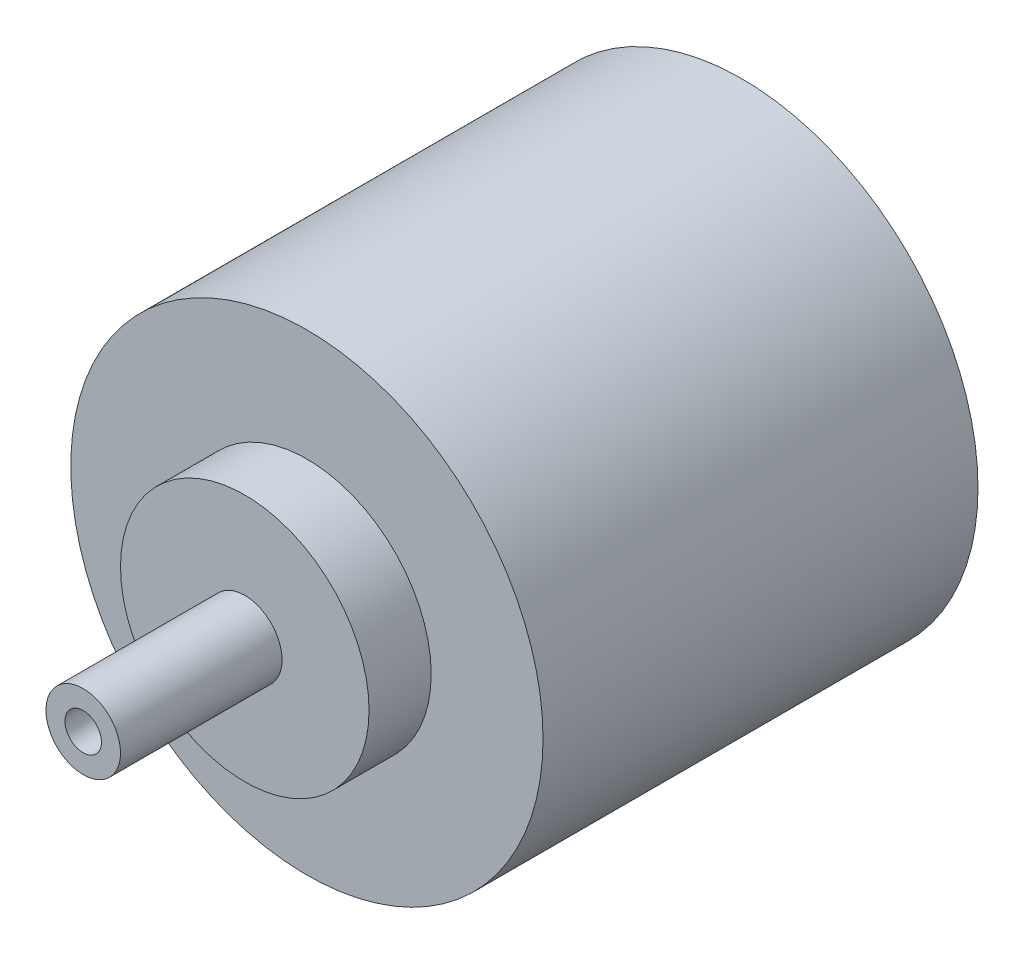
ISO-10303-21;
HEADER;
FILE_DESCRIPTION(('STEP AP214'),'2;1');
FILE_NAME('part.step','',(''),(''),'','','');
FILE_SCHEMA(('AUTOMOTIVE_DESIGN { 1 0 10303 214 1 1 1 1 }'));
ENDSEC;
DATA;
#1=APPLICATION_CONTEXT('core data for automotive mechanical design processes');
#2=APPLICATION_PROTOCOL_DEFINITION('international standard','automotive_design',2000,#1);
#3=PRODUCT_CONTEXT('',#1,'mechanical');
#4=PRODUCT('Part','Part','',(#3));
#5=PRODUCT_RELATED_PRODUCT_CATEGORY('part','',(#4));
#6=PRODUCT_DEFINITION_FORMATION('','',#4);
#7=PRODUCT_DEFINITION_CONTEXT('part definition',#1,'design');
#8=PRODUCT_DEFINITION('design','',#6,#7);
#9=PRODUCT_DEFINITION_SHAPE('','',#8);
#10=(LENGTH_UNIT() NAMED_UNIT(*) SI_UNIT(.MILLI.,.METRE.));
#11=(NAMED_UNIT(*) PLANE_ANGLE_UNIT() SI_UNIT($,.RADIAN.));
#12=(NAMED_UNIT(*) SI_UNIT($,.STERADIAN.) SOLID_ANGLE_UNIT());
#13=UNCERTAINTY_MEASURE_WITH_UNIT(LENGTH_MEASURE(1.E-05),#10,'distance_accuracy_value','');
#14=(GEOMETRIC_REPRESENTATION_CONTEXT(3) GLOBAL_UNCERTAINTY_ASSIGNED_CONTEXT((#13)) GLOBAL_UNIT_ASSIGNED_CONTEXT((#10,
#11,#12)) REPRESENTATION_CONTEXT('',''));
#15=CARTESIAN_POINT('',(0.,0.,0.));
#16=DIRECTION('',(0.,0.,1.));
#17=DIRECTION('',(1.,0.,0.));
#18=AXIS2_PLACEMENT_3D('',#15,#16,#17);
#19=CARTESIAN_POINT('',(0.,0.,-16.2496447043044));
#20=DIRECTION('',(0.,0.,1.));
#21=DIRECTION('',(1.,0.,0.));
#22=AXIS2_PLACEMENT_3D('',#19,#20,#21);
#23=CYLINDRICAL_SURFACE('',#22,3.);
#24=CARTESIAN_POINT('',(0.,0.,0.));
#25=DIRECTION('',(0.,0.,1.));
#26=DIRECTION('',(1.,0.,0.));
#27=AXIS2_PLACEMENT_3D('',#24,#25,#26);
#28=CIRCLE('',#27,3.);
#29=CARTESIAN_POINT('',(3.,0.,0.));
#30=VERTEX_POINT('',#29);
#31=EDGE_CURVE('E10',#30,#30,#28,.T.);
#32=ORIENTED_EDGE('',*,*,#31,.F.);
#33=EDGE_LOOP('',(#32));
#34=FACE_BOUND('',#33,.T.);
#35=CARTESIAN_POINT('',(0.,0.,-13.));
#36=DIRECTION('',(0.,0.,1.));
#37=DIRECTION('',(1.,0.,0.));
#38=AXIS2_PLACEMENT_3D('',#35,#36,#37);
#39=CIRCLE('',#38,3.);
#40=CARTESIAN_POINT('',(3.,0.,-13.));
#41=VERTEX_POINT('',#40);
#42=EDGE_CURVE('E63',#41,#41,#39,.T.);
#43=ORIENTED_EDGE('',*,*,#42,.T.);
#44=EDGE_LOOP('',(#43));
#45=FACE_BOUND('',#44,.T.);
#46=ADVANCED_FACE('F35',(#34,#45),#23,.T.);
#47=CARTESIAN_POINT('',(0.,1.47098235319208,0.));
#48=DIRECTION('',(0.,0.,-1.));
#49=DIRECTION('',(-1.,0.,0.));
#50=AXIS2_PLACEMENT_3D('',#47,#48,#49);
#51=PLANE('',#50);
#52=CARTESIAN_POINT('',(0.,0.,0.));
#53=DIRECTION('',(0.,0.,1.));
#54=DIRECTION('',(1.,0.,0.));
#55=AXIS2_PLACEMENT_3D('',#52,#53,#54);
#56=CIRCLE('',#55,1.47098235319208);
#57=CARTESIAN_POINT('',(1.47098235319208,0.,0.));
#58=VERTEX_POINT('',#57);
#59=EDGE_CURVE('E41',#58,#58,#56,.T.);
#60=ORIENTED_EDGE('',*,*,#59,.F.);
#61=EDGE_LOOP('',(#60));
#62=FACE_BOUND('',#61,.T.);
#63=ORIENTED_EDGE('',*,*,#31,.T.);
#64=EDGE_LOOP('',(#63));
#65=FACE_BOUND('',#64,.T.);
#66=ADVANCED_FACE('F103',(#62,#65),#51,.F.);
#67=CARTESIAN_POINT('',(0.,0.,-16.2496447043044));
#68=DIRECTION('',(0.,0.,1.));
#69=DIRECTION('',(1.,0.,0.));
#70=AXIS2_PLACEMENT_3D('',#67,#68,#69);
#71=CYLINDRICAL_SURFACE('',#70,1.47098235319208);
#72=CARTESIAN_POINT('',(0.,0.,-16.2496447043044));
#73=DIRECTION('',(0.,0.,1.));
#74=DIRECTION('',(1.,0.,0.));
#75=AXIS2_PLACEMENT_3D('',#72,#73,#74);
#76=CIRCLE('',#75,1.47098235319208);
#77=CARTESIAN_POINT('',(1.47098235319208,0.,-16.2496447043044));
#78=VERTEX_POINT('',#77);
#79=EDGE_CURVE('E45',#78,#78,#76,.T.);
#80=ORIENTED_EDGE('',*,*,#79,.F.);
#81=EDGE_LOOP('',(#80));
#82=FACE_BOUND('',#81,.T.);
#83=ORIENTED_EDGE('',*,*,#59,.T.);
#84=EDGE_LOOP('',(#83));
#85=FACE_BOUND('',#84,.T.);
#86=ADVANCED_FACE('F99',(#82,#85),#71,.F.);
#87=CARTESIAN_POINT('',(0.,0.,-16.2496447043044));
#88=DIRECTION('',(0.,0.,-1.));
#89=DIRECTION('',(-1.,0.,0.));
#90=AXIS2_PLACEMENT_3D('',#87,#88,#89);
#91=PLANE('',#90);
#92=ORIENTED_EDGE('',*,*,#79,.T.);
#93=EDGE_LOOP('',(#92));
#94=FACE_BOUND('',#93,.T.);
#95=ADVANCED_FACE('F94',(#94),#91,.F.);
#96=CARTESIAN_POINT('',(0.,19.,-53.));
#97=DIRECTION('',(0.,0.,1.));
#98=DIRECTION('',(1.,0.,0.));
#99=AXIS2_PLACEMENT_3D('',#96,#97,#98);
#100=PLANE('',#99);
#101=CARTESIAN_POINT('',(0.,0.,-53.));
#102=DIRECTION('',(0.,0.,1.));
#103=DIRECTION('',(1.,0.,0.));
#104=AXIS2_PLACEMENT_3D('',#101,#102,#103);
#105=CIRCLE('',#104,19.);
#106=CARTESIAN_POINT('',(19.,0.,-53.));
#107=VERTEX_POINT('',#106);
#108=EDGE_CURVE('E49',#107,#107,#105,.T.);
#109=ORIENTED_EDGE('',*,*,#108,.F.);
#110=EDGE_LOOP('',(#109));
#111=FACE_BOUND('',#110,.T.);
#112=ADVANCED_FACE('F89',(#111),#100,.F.);
#113=CARTESIAN_POINT('',(0.,0.,-16.2496447043044));
#114=DIRECTION('',(0.,0.,1.));
#115=DIRECTION('',(1.,0.,0.));
#116=AXIS2_PLACEMENT_3D('',#113,#114,#115);
#117=CYLINDRICAL_SURFACE('',#116,19.);
#118=CARTESIAN_POINT('',(0.,0.,-18.));
#119=DIRECTION('',(0.,0.,1.));
#120=DIRECTION('',(1.,0.,0.));
#121=AXIS2_PLACEMENT_3D('',#118,#119,#120);
#122=CIRCLE('',#121,19.);
#123=CARTESIAN_POINT('',(19.,0.,-18.));
#124=VERTEX_POINT('',#123);
#125=EDGE_CURVE('E54',#124,#124,#122,.T.);
#126=ORIENTED_EDGE('',*,*,#125,.F.);
#127=EDGE_LOOP('',(#126));
#128=FACE_BOUND('',#127,.T.);
#129=ORIENTED_EDGE('',*,*,#108,.T.);
#130=EDGE_LOOP('',(#129));
#131=FACE_BOUND('',#130,.T.);
#132=ADVANCED_FACE('F83',(#128,#131),#117,.T.);
#133=CARTESIAN_POINT('',(0.,10.,-18.));
#134=DIRECTION('',(0.,0.,-1.));
#135=DIRECTION('',(-1.,0.,0.));
#136=AXIS2_PLACEMENT_3D('',#133,#134,#135);
#137=PLANE('',#136);
#138=CARTESIAN_POINT('',(0.,0.,-18.));
#139=DIRECTION('',(0.,0.,1.));
#140=DIRECTION('',(1.,0.,0.));
#141=AXIS2_PLACEMENT_3D('',#138,#139,#140);
#142=CIRCLE('',#141,10.);
#143=CARTESIAN_POINT('',(10.,0.,-18.));
#144=VERTEX_POINT('',#143);
#145=EDGE_CURVE('E57',#144,#144,#142,.T.);
#146=ORIENTED_EDGE('',*,*,#145,.F.);
#147=EDGE_LOOP('',(#146));
#148=FACE_BOUND('',#147,.T.);
#149=ORIENTED_EDGE('',*,*,#125,.T.);
#150=EDGE_LOOP('',(#149));
#151=FACE_BOUND('',#150,.T.);
#152=ADVANCED_FACE('F77',(#148,#151),#137,.F.);
#153=CARTESIAN_POINT('',(0.,0.,-16.2496447043044));
#154=DIRECTION('',(0.,0.,1.));
#155=DIRECTION('',(1.,0.,0.));
#156=AXIS2_PLACEMENT_3D('',#153,#154,#155);
#157=CYLINDRICAL_SURFACE('',#156,10.);
#158=CARTESIAN_POINT('',(0.,0.,-13.));
#159=DIRECTION('',(0.,0.,1.));
#160=DIRECTION('',(1.,0.,0.));
#161=AXIS2_PLACEMENT_3D('',#158,#159,#160);
#162=CIRCLE('',#161,10.);
#163=CARTESIAN_POINT('',(10.,0.,-13.));
#164=VERTEX_POINT('',#163);
#165=EDGE_CURVE('E60',#164,#164,#162,.T.);
#166=ORIENTED_EDGE('',*,*,#165,.F.);
#167=EDGE_LOOP('',(#166));
#168=FACE_BOUND('',#167,.T.);
#169=ORIENTED_EDGE('',*,*,#145,.T.);
#170=EDGE_LOOP('',(#169));
#171=FACE_BOUND('',#170,.T.);
#172=ADVANCED_FACE('F71',(#168,#171),#157,.T.);
#173=CARTESIAN_POINT('',(0.,3.,-13.));
#174=DIRECTION('',(0.,0.,-1.));
#175=DIRECTION('',(-1.,0.,0.));
#176=AXIS2_PLACEMENT_3D('',#173,#174,#175);
#177=PLANE('',#176);
#178=ORIENTED_EDGE('',*,*,#42,.F.);
#179=EDGE_LOOP('',(#178));
#180=FACE_BOUND('',#179,.T.);
#181=ORIENTED_EDGE('',*,*,#165,.T.);
#182=EDGE_LOOP('',(#181));
#183=FACE_BOUND('',#182,.T.);
#184=ADVANCED_FACE('F68',(#180,#183),#177,.F.);
#185=CLOSED_SHELL('',(#46,#66,#86,#95,#112,#132,#152,#172,#184));
#186=MANIFOLD_SOLID_BREP('B2',#185);
#187=ADVANCED_BREP_SHAPE_REPRESENTATION('',(#18,#186),#14);
#188=SHAPE_DEFINITION_REPRESENTATION(#9,#187);
ENDSEC;
END-ISO-10303-21;
